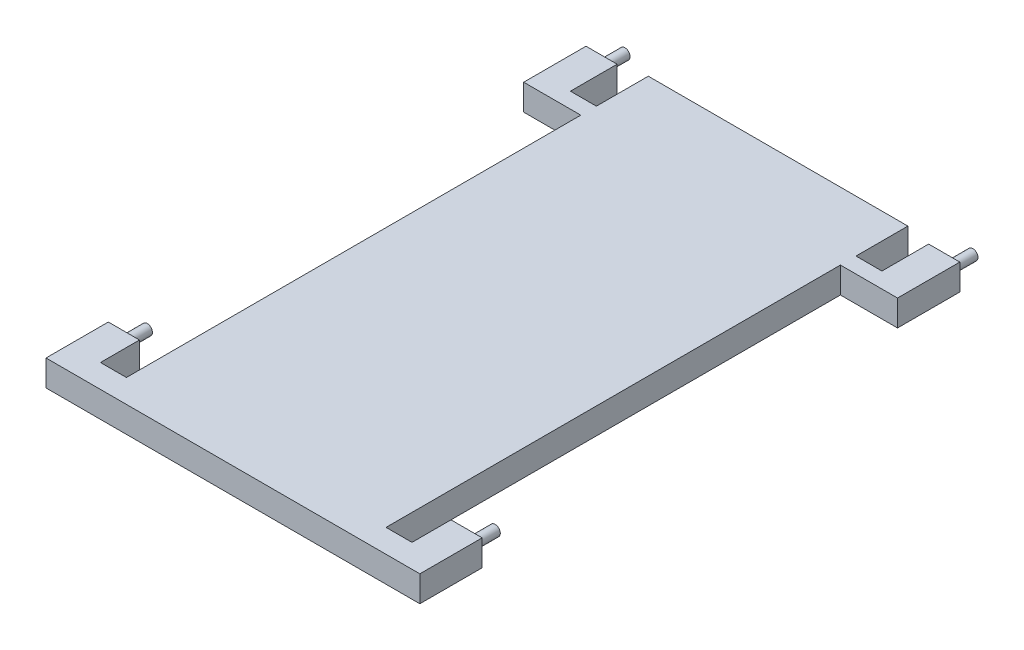
ISO-10303-21;
HEADER;
FILE_DESCRIPTION(('STEP AP214'),'2;1');
FILE_NAME('part.step','',(''),(''),'','','');
FILE_SCHEMA(('AUTOMOTIVE_DESIGN { 1 0 10303 214 1 1 1 1 }'));
ENDSEC;
DATA;
#1=APPLICATION_CONTEXT('core data for automotive mechanical design processes');
#2=APPLICATION_PROTOCOL_DEFINITION('international standard','automotive_design',2000,#1);
#3=PRODUCT_CONTEXT('',#1,'mechanical');
#4=PRODUCT('Part','Part','',(#3));
#5=PRODUCT_RELATED_PRODUCT_CATEGORY('part','',(#4));
#6=PRODUCT_DEFINITION_FORMATION('','',#4);
#7=PRODUCT_DEFINITION_CONTEXT('part definition',#1,'design');
#8=PRODUCT_DEFINITION('design','',#6,#7);
#9=PRODUCT_DEFINITION_SHAPE('','',#8);
#10=(LENGTH_UNIT() NAMED_UNIT(*) SI_UNIT(.MILLI.,.METRE.));
#11=(NAMED_UNIT(*) PLANE_ANGLE_UNIT() SI_UNIT($,.RADIAN.));
#12=(NAMED_UNIT(*) SI_UNIT($,.STERADIAN.) SOLID_ANGLE_UNIT());
#13=UNCERTAINTY_MEASURE_WITH_UNIT(LENGTH_MEASURE(1.E-05),#10,'distance_accuracy_value','');
#14=(GEOMETRIC_REPRESENTATION_CONTEXT(3) GLOBAL_UNCERTAINTY_ASSIGNED_CONTEXT((#13)) GLOBAL_UNIT_ASSIGNED_CONTEXT((#10,
#11,#12)) REPRESENTATION_CONTEXT('',''));
#15=CARTESIAN_POINT('',(0.,0.,0.));
#16=DIRECTION('',(0.,0.,1.));
#17=DIRECTION('',(1.,0.,0.));
#18=AXIS2_PLACEMENT_3D('',#15,#16,#17);
#19=CARTESIAN_POINT('',(1523.8355420944,50.,412.398825065192));
#20=DIRECTION('',(0.,0.,-1.));
#21=DIRECTION('',(-1.,0.,0.));
#22=AXIS2_PLACEMENT_3D('',#19,#20,#21);
#23=PLANE('',#22);
#24=DIRECTION('',(1.,0.,0.));
#25=VECTOR('',#24,1.);
#26=CARTESIAN_POINT('',(1523.8355420944,0.,412.398825065192));
#27=LINE('',#26,#25);
#28=CARTESIAN_POINT('',(803.835542094402,0.,412.398825065192));
#29=VERTEX_POINT('',#28);
#30=CARTESIAN_POINT('',(1523.8355420944,0.,412.398825065192));
#31=VERTEX_POINT('',#30);
#32=EDGE_CURVE('E135',#29,#31,#27,.T.);
#33=ORIENTED_EDGE('',*,*,#32,.T.);
#34=DIRECTION('',(0.,-1.,0.));
#35=VECTOR('',#34,1.);
#36=CARTESIAN_POINT('',(1523.8355420944,50.,412.398825065192));
#37=LINE('',#36,#35);
#38=CARTESIAN_POINT('',(1523.8355420944,50.,412.398825065192));
#39=VERTEX_POINT('',#38);
#40=EDGE_CURVE('E334',#39,#31,#37,.T.);
#41=ORIENTED_EDGE('',*,*,#40,.F.);
#42=DIRECTION('',(1.,0.,0.));
#43=VECTOR('',#42,1.);
#44=CARTESIAN_POINT('',(803.835542094402,50.,412.398825065192));
#45=LINE('',#44,#43);
#46=CARTESIAN_POINT('',(803.835542094402,50.,412.398825065192));
#47=VERTEX_POINT('',#46);
#48=EDGE_CURVE('E141',#47,#39,#45,.T.);
#49=ORIENTED_EDGE('',*,*,#48,.F.);
#50=DIRECTION('',(0.,-1.,0.));
#51=VECTOR('',#50,1.);
#52=CARTESIAN_POINT('',(803.835542094402,50.,412.398825065192));
#53=LINE('',#52,#51);
#54=EDGE_CURVE('E223',#47,#29,#53,.T.);
#55=ORIENTED_EDGE('',*,*,#54,.T.);
#56=EDGE_LOOP('',(#33,#41,#49,#55));
#57=FACE_BOUND('',#56,.T.);
#58=ADVANCED_FACE('F35',(#57),#23,.F.);
#59=CARTESIAN_POINT('',(1523.8355420944,50.,292.398825065192));
#60=DIRECTION('',(-1.,0.,0.));
#61=DIRECTION('',(0.,0.,1.));
#62=AXIS2_PLACEMENT_3D('',#59,#60,#61);
#63=PLANE('',#62);
#64=DIRECTION('',(0.,0.,-1.));
#65=VECTOR('',#64,1.);
#66=CARTESIAN_POINT('',(1523.8355420944,0.,292.398825065192));
#67=LINE('',#66,#65);
#68=CARTESIAN_POINT('',(1523.8355420944,0.,292.398825065192));
#69=VERTEX_POINT('',#68);
#70=EDGE_CURVE('E228',#31,#69,#67,.T.);
#71=ORIENTED_EDGE('',*,*,#70,.T.);
#72=DIRECTION('',(0.,-1.,0.));
#73=VECTOR('',#72,1.);
#74=CARTESIAN_POINT('',(1523.8355420944,50.,292.398825065192));
#75=LINE('',#74,#73);
#76=CARTESIAN_POINT('',(1523.8355420944,50.,292.398825065192));
#77=VERTEX_POINT('',#76);
#78=EDGE_CURVE('E331',#77,#69,#75,.T.);
#79=ORIENTED_EDGE('',*,*,#78,.F.);
#80=DIRECTION('',(0.,0.,-1.));
#81=VECTOR('',#80,1.);
#82=CARTESIAN_POINT('',(1523.8355420944,50.,292.398825065192));
#83=LINE('',#82,#81);
#84=EDGE_CURVE('E411',#39,#77,#83,.T.);
#85=ORIENTED_EDGE('',*,*,#84,.F.);
#86=ORIENTED_EDGE('',*,*,#40,.T.);
#87=EDGE_LOOP('',(#71,#79,#85,#86));
#88=FACE_BOUND('',#87,.T.);
#89=ADVANCED_FACE('F459',(#88),#63,.F.);
#90=CARTESIAN_POINT('',(1463.8355420944,50.,292.398825065192));
#91=DIRECTION('',(0.,0.,1.));
#92=DIRECTION('',(1.,0.,0.));
#93=AXIS2_PLACEMENT_3D('',#90,#91,#92);
#94=PLANE('',#93);
#95=CARTESIAN_POINT('',(1498.8355420944,25.,292.398825065192));
#96=DIRECTION('',(0.,0.,1.));
#97=DIRECTION('',(1.,0.,0.));
#98=AXIS2_PLACEMENT_3D('',#95,#96,#97);
#99=CIRCLE('',#98,10.0000000000001);
#100=CARTESIAN_POINT('',(1508.8355420944,25.,292.398825065192));
#101=VERTEX_POINT('',#100);
#102=EDGE_CURVE('E11',#101,#101,#99,.F.);
#103=ORIENTED_EDGE('',*,*,#102,.F.);
#104=EDGE_LOOP('',(#103));
#105=FACE_BOUND('',#104,.T.);
#106=DIRECTION('',(-1.,0.,0.));
#107=VECTOR('',#106,1.);
#108=CARTESIAN_POINT('',(1463.8355420944,0.,292.398825065192));
#109=LINE('',#108,#107);
#110=CARTESIAN_POINT('',(1463.8355420944,0.,292.398825065192));
#111=VERTEX_POINT('',#110);
#112=EDGE_CURVE('E231',#69,#111,#109,.T.);
#113=ORIENTED_EDGE('',*,*,#112,.T.);
#114=DIRECTION('',(0.,-1.,0.));
#115=VECTOR('',#114,1.);
#116=CARTESIAN_POINT('',(1463.8355420944,50.,292.398825065192));
#117=LINE('',#116,#115);
#118=CARTESIAN_POINT('',(1463.8355420944,50.,292.398825065192));
#119=VERTEX_POINT('',#118);
#120=EDGE_CURVE('E328',#119,#111,#117,.T.);
#121=ORIENTED_EDGE('',*,*,#120,.F.);
#122=DIRECTION('',(-1.,0.,0.));
#123=VECTOR('',#122,1.);
#124=CARTESIAN_POINT('',(1463.8355420944,50.,292.398825065192));
#125=LINE('',#124,#123);
#126=EDGE_CURVE('E413',#77,#119,#125,.T.);
#127=ORIENTED_EDGE('',*,*,#126,.F.);
#128=ORIENTED_EDGE('',*,*,#78,.T.);
#129=EDGE_LOOP('',(#113,#121,#127,#128));
#130=FACE_BOUND('',#129,.T.);
#131=ADVANCED_FACE('F456',(#105,#130),#94,.F.);
#132=CARTESIAN_POINT('',(1463.8355420944,50.,367.50947658537));
#133=DIRECTION('',(1.,0.,0.));
#134=DIRECTION('',(0.,0.,-1.));
#135=AXIS2_PLACEMENT_3D('',#132,#133,#134);
#136=PLANE('',#135);
#137=DIRECTION('',(0.,0.,1.));
#138=VECTOR('',#137,1.);
#139=CARTESIAN_POINT('',(1463.8355420944,0.,367.50947658537));
#140=LINE('',#139,#138);
#141=CARTESIAN_POINT('',(1463.8355420944,0.,367.50947658537));
#142=VERTEX_POINT('',#141);
#143=EDGE_CURVE('E233',#111,#142,#140,.T.);
#144=ORIENTED_EDGE('',*,*,#143,.T.);
#145=DIRECTION('',(0.,-1.,0.));
#146=VECTOR('',#145,1.);
#147=CARTESIAN_POINT('',(1463.8355420944,50.,367.50947658537));
#148=LINE('',#147,#146);
#149=CARTESIAN_POINT('',(1463.8355420944,50.,367.50947658537));
#150=VERTEX_POINT('',#149);
#151=EDGE_CURVE('E325',#150,#142,#148,.T.);
#152=ORIENTED_EDGE('',*,*,#151,.F.);
#153=DIRECTION('',(0.,0.,1.));
#154=VECTOR('',#153,1.);
#155=CARTESIAN_POINT('',(1463.8355420944,50.,367.50947658537));
#156=LINE('',#155,#154);
#157=EDGE_CURVE('E419',#119,#150,#156,.T.);
#158=ORIENTED_EDGE('',*,*,#157,.F.);
#159=ORIENTED_EDGE('',*,*,#120,.T.);
#160=EDGE_LOOP('',(#144,#152,#158,#159));
#161=FACE_BOUND('',#160,.T.);
#162=ADVANCED_FACE('F451',(#161),#136,.F.);
#163=CARTESIAN_POINT('',(1413.8355420944,50.,367.50947658537));
#164=DIRECTION('',(0.,0.,1.));
#165=DIRECTION('',(1.,0.,0.));
#166=AXIS2_PLACEMENT_3D('',#163,#164,#165);
#167=PLANE('',#166);
#168=DIRECTION('',(-1.,0.,0.));
#169=VECTOR('',#168,1.);
#170=CARTESIAN_POINT('',(1413.8355420944,0.,367.50947658537));
#171=LINE('',#170,#169);
#172=CARTESIAN_POINT('',(1413.8355420944,0.,367.50947658537));
#173=VERTEX_POINT('',#172);
#174=EDGE_CURVE('E235',#142,#173,#171,.T.);
#175=ORIENTED_EDGE('',*,*,#174,.T.);
#176=DIRECTION('',(0.,-1.,0.));
#177=VECTOR('',#176,1.);
#178=CARTESIAN_POINT('',(1413.8355420944,50.,367.50947658537));
#179=LINE('',#178,#177);
#180=CARTESIAN_POINT('',(1413.8355420944,50.,367.50947658537));
#181=VERTEX_POINT('',#180);
#182=EDGE_CURVE('E322',#181,#173,#179,.T.);
#183=ORIENTED_EDGE('',*,*,#182,.F.);
#184=DIRECTION('',(-1.,0.,0.));
#185=VECTOR('',#184,1.);
#186=CARTESIAN_POINT('',(1413.8355420944,50.,367.50947658537));
#187=LINE('',#186,#185);
#188=EDGE_CURVE('E421',#150,#181,#187,.T.);
#189=ORIENTED_EDGE('',*,*,#188,.F.);
#190=ORIENTED_EDGE('',*,*,#151,.T.);
#191=EDGE_LOOP('',(#175,#183,#189,#190));
#192=FACE_BOUND('',#191,.T.);
#193=ADVANCED_FACE('F446',(#192),#167,.F.);
#194=CARTESIAN_POINT('',(1413.8355420944,50.,-507.601174934808));
#195=DIRECTION('',(-1.,0.,0.));
#196=DIRECTION('',(0.,0.,1.));
#197=AXIS2_PLACEMENT_3D('',#194,#195,#196);
#198=PLANE('',#197);
#199=DIRECTION('',(0.,0.,-1.));
#200=VECTOR('',#199,1.);
#201=CARTESIAN_POINT('',(1413.8355420944,0.,-507.601174934808));
#202=LINE('',#201,#200);
#203=CARTESIAN_POINT('',(1413.8355420944,0.,-507.601174934808));
#204=VERTEX_POINT('',#203);
#205=EDGE_CURVE('E237',#173,#204,#202,.T.);
#206=ORIENTED_EDGE('',*,*,#205,.T.);
#207=DIRECTION('',(0.,-1.,0.));
#208=VECTOR('',#207,1.);
#209=CARTESIAN_POINT('',(1413.8355420944,50.,-507.601174934808));
#210=LINE('',#209,#208);
#211=CARTESIAN_POINT('',(1413.8355420944,50.,-507.601174934808));
#212=VERTEX_POINT('',#211);
#213=EDGE_CURVE('E319',#212,#204,#210,.T.);
#214=ORIENTED_EDGE('',*,*,#213,.F.);
#215=DIRECTION('',(0.,0.,-1.));
#216=VECTOR('',#215,1.);
#217=CARTESIAN_POINT('',(1413.8355420944,50.,-507.601174934808));
#218=LINE('',#217,#216);
#219=EDGE_CURVE('E423',#181,#212,#218,.T.);
#220=ORIENTED_EDGE('',*,*,#219,.F.);
#221=ORIENTED_EDGE('',*,*,#182,.T.);
#222=EDGE_LOOP('',(#206,#214,#220,#221));
#223=FACE_BOUND('',#222,.T.);
#224=ADVANCED_FACE('F442',(#223),#198,.F.);
#225=CARTESIAN_POINT('',(1523.8355420944,50.,-507.601174934808));
#226=DIRECTION('',(0.,0.,-1.));
#227=DIRECTION('',(-1.,0.,0.));
#228=AXIS2_PLACEMENT_3D('',#225,#226,#227);
#229=PLANE('',#228);
#230=DIRECTION('',(1.,0.,0.));
#231=VECTOR('',#230,1.);
#232=CARTESIAN_POINT('',(1523.8355420944,0.,-507.601174934808));
#233=LINE('',#232,#231);
#234=CARTESIAN_POINT('',(1523.8355420944,0.,-507.601174934808));
#235=VERTEX_POINT('',#234);
#236=EDGE_CURVE('E239',#204,#235,#233,.T.);
#237=ORIENTED_EDGE('',*,*,#236,.T.);
#238=DIRECTION('',(0.,-1.,0.));
#239=VECTOR('',#238,1.);
#240=CARTESIAN_POINT('',(1523.8355420944,50.,-507.601174934808));
#241=LINE('',#240,#239);
#242=CARTESIAN_POINT('',(1523.8355420944,50.,-507.601174934808));
#243=VERTEX_POINT('',#242);
#244=EDGE_CURVE('E316',#243,#235,#241,.T.);
#245=ORIENTED_EDGE('',*,*,#244,.F.);
#246=DIRECTION('',(1.,0.,0.));
#247=VECTOR('',#246,1.);
#248=CARTESIAN_POINT('',(1523.8355420944,50.,-507.601174934808));
#249=LINE('',#248,#247);
#250=EDGE_CURVE('E425',#212,#243,#249,.T.);
#251=ORIENTED_EDGE('',*,*,#250,.F.);
#252=ORIENTED_EDGE('',*,*,#213,.T.);
#253=EDGE_LOOP('',(#237,#245,#251,#252));
#254=FACE_BOUND('',#253,.T.);
#255=ADVANCED_FACE('F438',(#254),#229,.F.);
#256=CARTESIAN_POINT('',(1523.8355420944,50.,-627.601174934808));
#257=DIRECTION('',(-1.,0.,0.));
#258=DIRECTION('',(0.,0.,1.));
#259=AXIS2_PLACEMENT_3D('',#256,#257,#258);
#260=PLANE('',#259);
#261=DIRECTION('',(0.,0.,-1.));
#262=VECTOR('',#261,1.);
#263=CARTESIAN_POINT('',(1523.8355420944,0.,-627.601174934808));
#264=LINE('',#263,#262);
#265=CARTESIAN_POINT('',(1523.8355420944,0.,-627.601174934808));
#266=VERTEX_POINT('',#265);
#267=EDGE_CURVE('E241',#235,#266,#264,.T.);
#268=ORIENTED_EDGE('',*,*,#267,.T.);
#269=DIRECTION('',(0.,-1.,0.));
#270=VECTOR('',#269,1.);
#271=CARTESIAN_POINT('',(1523.8355420944,50.,-627.601174934808));
#272=LINE('',#271,#270);
#273=CARTESIAN_POINT('',(1523.8355420944,50.,-627.601174934808));
#274=VERTEX_POINT('',#273);
#275=EDGE_CURVE('E313',#274,#266,#272,.T.);
#276=ORIENTED_EDGE('',*,*,#275,.F.);
#277=DIRECTION('',(0.,0.,-1.));
#278=VECTOR('',#277,1.);
#279=CARTESIAN_POINT('',(1523.8355420944,50.,-627.601174934808));
#280=LINE('',#279,#278);
#281=EDGE_CURVE('E427',#243,#274,#280,.T.);
#282=ORIENTED_EDGE('',*,*,#281,.F.);
#283=ORIENTED_EDGE('',*,*,#244,.T.);
#284=EDGE_LOOP('',(#268,#276,#282,#283));
#285=FACE_BOUND('',#284,.T.);
#286=ADVANCED_FACE('F351',(#285),#260,.F.);
#287=CARTESIAN_POINT('',(1463.8355420944,50.,-627.601174934808));
#288=DIRECTION('',(0.,0.,1.));
#289=DIRECTION('',(1.,0.,0.));
#290=AXIS2_PLACEMENT_3D('',#287,#288,#289);
#291=PLANE('',#290);
#292=CARTESIAN_POINT('',(1498.8355420944,25.,-627.601174934808));
#293=DIRECTION('',(0.,0.,1.));
#294=DIRECTION('',(1.,0.,0.));
#295=AXIS2_PLACEMENT_3D('',#292,#293,#294);
#296=CIRCLE('',#295,10.0000000000001);
#297=CARTESIAN_POINT('',(1508.8355420944,25.,-627.601174934808));
#298=VERTEX_POINT('',#297);
#299=EDGE_CURVE('E43',#298,#298,#296,.F.);
#300=ORIENTED_EDGE('',*,*,#299,.F.);
#301=EDGE_LOOP('',(#300));
#302=FACE_BOUND('',#301,.T.);
#303=DIRECTION('',(-1.,0.,0.));
#304=VECTOR('',#303,1.);
#305=CARTESIAN_POINT('',(1463.8355420944,0.,-627.601174934808));
#306=LINE('',#305,#304);
#307=CARTESIAN_POINT('',(1463.8355420944,0.,-627.601174934808));
#308=VERTEX_POINT('',#307);
#309=EDGE_CURVE('E243',#266,#308,#306,.T.);
#310=ORIENTED_EDGE('',*,*,#309,.T.);
#311=DIRECTION('',(0.,-1.,0.));
#312=VECTOR('',#311,1.);
#313=CARTESIAN_POINT('',(1463.8355420944,50.,-627.601174934808));
#314=LINE('',#313,#312);
#315=CARTESIAN_POINT('',(1463.8355420944,50.,-627.601174934808));
#316=VERTEX_POINT('',#315);
#317=EDGE_CURVE('E310',#316,#308,#314,.T.);
#318=ORIENTED_EDGE('',*,*,#317,.F.);
#319=DIRECTION('',(-1.,0.,0.));
#320=VECTOR('',#319,1.);
#321=CARTESIAN_POINT('',(1463.8355420944,50.,-627.601174934808));
#322=LINE('',#321,#320);
#323=EDGE_CURVE('E429',#274,#316,#322,.T.);
#324=ORIENTED_EDGE('',*,*,#323,.F.);
#325=ORIENTED_EDGE('',*,*,#275,.T.);
#326=EDGE_LOOP('',(#310,#318,#324,#325));
#327=FACE_BOUND('',#326,.T.);
#328=ADVANCED_FACE('F347',(#302,#327),#291,.F.);
#329=CARTESIAN_POINT('',(1463.8355420944,50.,-537.601174934808));
#330=DIRECTION('',(1.,0.,0.));
#331=DIRECTION('',(0.,0.,-1.));
#332=AXIS2_PLACEMENT_3D('',#329,#330,#331);
#333=PLANE('',#332);
#334=DIRECTION('',(0.,0.,1.));
#335=VECTOR('',#334,1.);
#336=CARTESIAN_POINT('',(1463.8355420944,0.,-537.601174934808));
#337=LINE('',#336,#335);
#338=CARTESIAN_POINT('',(1463.8355420944,0.,-537.601174934808));
#339=VERTEX_POINT('',#338);
#340=EDGE_CURVE('E245',#308,#339,#337,.T.);
#341=ORIENTED_EDGE('',*,*,#340,.T.);
#342=DIRECTION('',(0.,-1.,0.));
#343=VECTOR('',#342,1.);
#344=CARTESIAN_POINT('',(1463.8355420944,50.,-537.601174934808));
#345=LINE('',#344,#343);
#346=CARTESIAN_POINT('',(1463.8355420944,50.,-537.601174934808));
#347=VERTEX_POINT('',#346);
#348=EDGE_CURVE('E307',#347,#339,#345,.T.);
#349=ORIENTED_EDGE('',*,*,#348,.F.);
#350=DIRECTION('',(0.,0.,1.));
#351=VECTOR('',#350,1.);
#352=CARTESIAN_POINT('',(1463.8355420944,50.,-537.601174934808));
#353=LINE('',#352,#351);
#354=EDGE_CURVE('E362',#316,#347,#353,.T.);
#355=ORIENTED_EDGE('',*,*,#354,.F.);
#356=ORIENTED_EDGE('',*,*,#317,.T.);
#357=EDGE_LOOP('',(#341,#349,#355,#356));
#358=FACE_BOUND('',#357,.T.);
#359=ADVANCED_FACE('F350',(#358),#333,.F.);
#360=CARTESIAN_POINT('',(1413.8355420944,50.,-537.601174934808));
#361=DIRECTION('',(0.,0.,1.));
#362=DIRECTION('',(1.,0.,0.));
#363=AXIS2_PLACEMENT_3D('',#360,#361,#362);
#364=PLANE('',#363);
#365=DIRECTION('',(-1.,0.,0.));
#366=VECTOR('',#365,1.);
#367=CARTESIAN_POINT('',(1413.8355420944,0.,-537.601174934808));
#368=LINE('',#367,#366);
#369=CARTESIAN_POINT('',(1413.8355420944,0.,-537.601174934808));
#370=VERTEX_POINT('',#369);
#371=EDGE_CURVE('E247',#339,#370,#368,.T.);
#372=ORIENTED_EDGE('',*,*,#371,.T.);
#373=DIRECTION('',(0.,-1.,0.));
#374=VECTOR('',#373,1.);
#375=CARTESIAN_POINT('',(1413.8355420944,50.,-537.601174934808));
#376=LINE('',#375,#374);
#377=CARTESIAN_POINT('',(1413.8355420944,50.,-537.601174934808));
#378=VERTEX_POINT('',#377);
#379=EDGE_CURVE('E304',#378,#370,#376,.T.);
#380=ORIENTED_EDGE('',*,*,#379,.F.);
#381=DIRECTION('',(-1.,0.,0.));
#382=VECTOR('',#381,1.);
#383=CARTESIAN_POINT('',(1413.8355420944,50.,-537.601174934808));
#384=LINE('',#383,#382);
#385=EDGE_CURVE('E378',#347,#378,#384,.T.);
#386=ORIENTED_EDGE('',*,*,#385,.F.);
#387=ORIENTED_EDGE('',*,*,#348,.T.);
#388=EDGE_LOOP('',(#372,#380,#386,#387));
#389=FACE_BOUND('',#388,.T.);
#390=ADVANCED_FACE('F369',(#389),#364,.F.);
#391=CARTESIAN_POINT('',(1413.8355420944,50.,-637.601174934808));
#392=DIRECTION('',(-1.,0.,0.));
#393=DIRECTION('',(0.,0.,1.));
#394=AXIS2_PLACEMENT_3D('',#391,#392,#393);
#395=PLANE('',#394);
#396=DIRECTION('',(0.,0.,-1.));
#397=VECTOR('',#396,1.);
#398=CARTESIAN_POINT('',(1413.8355420944,0.,-637.601174934808));
#399=LINE('',#398,#397);
#400=CARTESIAN_POINT('',(1413.8355420944,0.,-637.601174934808));
#401=VERTEX_POINT('',#400);
#402=EDGE_CURVE('E249',#370,#401,#399,.T.);
#403=ORIENTED_EDGE('',*,*,#402,.T.);
#404=DIRECTION('',(0.,-1.,0.));
#405=VECTOR('',#404,1.);
#406=CARTESIAN_POINT('',(1413.8355420944,50.,-637.601174934808));
#407=LINE('',#406,#405);
#408=CARTESIAN_POINT('',(1413.8355420944,50.,-637.601174934808));
#409=VERTEX_POINT('',#408);
#410=EDGE_CURVE('E301',#409,#401,#407,.T.);
#411=ORIENTED_EDGE('',*,*,#410,.F.);
#412=DIRECTION('',(0.,0.,-1.));
#413=VECTOR('',#412,1.);
#414=CARTESIAN_POINT('',(1413.8355420944,50.,-637.601174934808));
#415=LINE('',#414,#413);
#416=EDGE_CURVE('E375',#378,#409,#415,.T.);
#417=ORIENTED_EDGE('',*,*,#416,.F.);
#418=ORIENTED_EDGE('',*,*,#379,.T.);
#419=EDGE_LOOP('',(#403,#411,#417,#418));
#420=FACE_BOUND('',#419,.T.);
#421=ADVANCED_FACE('F373',(#420),#395,.F.);
#422=CARTESIAN_POINT('',(1413.8355420944,50.,-637.601174934808));
#423=DIRECTION('',(0.,0.,1.));
#424=DIRECTION('',(1.,0.,0.));
#425=AXIS2_PLACEMENT_3D('',#422,#423,#424);
#426=PLANE('',#425);
#427=DIRECTION('',(-1.,0.,0.));
#428=VECTOR('',#427,1.);
#429=CARTESIAN_POINT('',(1413.8355420944,0.,-637.601174934808));
#430=LINE('',#429,#428);
#431=CARTESIAN_POINT('',(913.835542094402,0.,-637.601174934808));
#432=VERTEX_POINT('',#431);
#433=EDGE_CURVE('E251',#401,#432,#430,.T.);
#434=ORIENTED_EDGE('',*,*,#433,.T.);
#435=DIRECTION('',(0.,-1.,0.));
#436=VECTOR('',#435,1.);
#437=CARTESIAN_POINT('',(913.835542094402,50.,-637.601174934808));
#438=LINE('',#437,#436);
#439=CARTESIAN_POINT('',(913.835542094402,50.,-637.601174934808));
#440=VERTEX_POINT('',#439);
#441=EDGE_CURVE('E298',#440,#432,#438,.T.);
#442=ORIENTED_EDGE('',*,*,#441,.F.);
#443=DIRECTION('',(-1.,0.,0.));
#444=VECTOR('',#443,1.);
#445=CARTESIAN_POINT('',(1413.8355420944,50.,-637.601174934808));
#446=LINE('',#445,#444);
#447=EDGE_CURVE('E377',#409,#440,#446,.T.);
#448=ORIENTED_EDGE('',*,*,#447,.F.);
#449=ORIENTED_EDGE('',*,*,#410,.T.);
#450=EDGE_LOOP('',(#434,#442,#448,#449));
#451=FACE_BOUND('',#450,.T.);
#452=ADVANCED_FACE('F484',(#451),#426,.F.);
#453=CARTESIAN_POINT('',(913.835542094402,50.,-637.601174934808));
#454=DIRECTION('',(1.,0.,0.));
#455=DIRECTION('',(0.,0.,-1.));
#456=AXIS2_PLACEMENT_3D('',#453,#454,#455);
#457=PLANE('',#456);
#458=DIRECTION('',(0.,0.,1.));
#459=VECTOR('',#458,1.);
#460=CARTESIAN_POINT('',(913.835542094402,0.,-637.601174934808));
#461=LINE('',#460,#459);
#462=CARTESIAN_POINT('',(913.835542094402,0.,-537.601174934808));
#463=VERTEX_POINT('',#462);
#464=EDGE_CURVE('E253',#432,#463,#461,.T.);
#465=ORIENTED_EDGE('',*,*,#464,.T.);
#466=DIRECTION('',(0.,-1.,0.));
#467=VECTOR('',#466,1.);
#468=CARTESIAN_POINT('',(913.835542094402,50.,-537.601174934808));
#469=LINE('',#468,#467);
#470=CARTESIAN_POINT('',(913.835542094402,50.,-537.601174934808));
#471=VERTEX_POINT('',#470);
#472=EDGE_CURVE('E295',#471,#463,#469,.T.);
#473=ORIENTED_EDGE('',*,*,#472,.F.);
#474=DIRECTION('',(0.,0.,1.));
#475=VECTOR('',#474,1.);
#476=CARTESIAN_POINT('',(913.835542094402,50.,-637.601174934808));
#477=LINE('',#476,#475);
#478=EDGE_CURVE('E380',#440,#471,#477,.T.);
#479=ORIENTED_EDGE('',*,*,#478,.F.);
#480=ORIENTED_EDGE('',*,*,#441,.T.);
#481=EDGE_LOOP('',(#465,#473,#479,#480));
#482=FACE_BOUND('',#481,.T.);
#483=ADVANCED_FACE('F487',(#482),#457,.F.);
#484=CARTESIAN_POINT('',(913.835542094402,50.,-537.601174934808));
#485=DIRECTION('',(0.,0.,1.));
#486=DIRECTION('',(1.,0.,0.));
#487=AXIS2_PLACEMENT_3D('',#484,#485,#486);
#488=PLANE('',#487);
#489=DIRECTION('',(-1.,0.,0.));
#490=VECTOR('',#489,1.);
#491=CARTESIAN_POINT('',(913.835542094402,0.,-537.601174934808));
#492=LINE('',#491,#490);
#493=CARTESIAN_POINT('',(863.835542094402,0.,-537.601174934808));
#494=VERTEX_POINT('',#493);
#495=EDGE_CURVE('E255',#463,#494,#492,.T.);
#496=ORIENTED_EDGE('',*,*,#495,.T.);
#497=DIRECTION('',(0.,-1.,0.));
#498=VECTOR('',#497,1.);
#499=CARTESIAN_POINT('',(863.835542094402,50.,-537.601174934808));
#500=LINE('',#499,#498);
#501=CARTESIAN_POINT('',(863.835542094402,50.,-537.601174934808));
#502=VERTEX_POINT('',#501);
#503=EDGE_CURVE('E292',#502,#494,#500,.T.);
#504=ORIENTED_EDGE('',*,*,#503,.F.);
#505=DIRECTION('',(-1.,0.,0.));
#506=VECTOR('',#505,1.);
#507=CARTESIAN_POINT('',(913.835542094402,50.,-537.601174934808));
#508=LINE('',#507,#506);
#509=EDGE_CURVE('E386',#471,#502,#508,.T.);
#510=ORIENTED_EDGE('',*,*,#509,.F.);
#511=ORIENTED_EDGE('',*,*,#472,.T.);
#512=EDGE_LOOP('',(#496,#504,#510,#511));
#513=FACE_BOUND('',#512,.T.);
#514=ADVANCED_FACE('F491',(#513),#488,.F.);
#515=CARTESIAN_POINT('',(863.835542094402,50.,-537.601174934808));
#516=DIRECTION('',(-1.,0.,0.));
#517=DIRECTION('',(0.,0.,1.));
#518=AXIS2_PLACEMENT_3D('',#515,#516,#517);
#519=PLANE('',#518);
#520=DIRECTION('',(0.,0.,-1.));
#521=VECTOR('',#520,1.);
#522=CARTESIAN_POINT('',(863.835542094402,0.,-537.601174934808));
#523=LINE('',#522,#521);
#524=CARTESIAN_POINT('',(863.835542094402,0.,-627.601174934808));
#525=VERTEX_POINT('',#524);
#526=EDGE_CURVE('E257',#494,#525,#523,.T.);
#527=ORIENTED_EDGE('',*,*,#526,.T.);
#528=DIRECTION('',(0.,-1.,0.));
#529=VECTOR('',#528,1.);
#530=CARTESIAN_POINT('',(863.835542094402,50.,-627.601174934808));
#531=LINE('',#530,#529);
#532=CARTESIAN_POINT('',(863.835542094402,50.,-627.601174934808));
#533=VERTEX_POINT('',#532);
#534=EDGE_CURVE('E289',#533,#525,#531,.T.);
#535=ORIENTED_EDGE('',*,*,#534,.F.);
#536=DIRECTION('',(0.,0.,-1.));
#537=VECTOR('',#536,1.);
#538=CARTESIAN_POINT('',(863.835542094402,50.,-537.601174934808));
#539=LINE('',#538,#537);
#540=EDGE_CURVE('E388',#502,#533,#539,.T.);
#541=ORIENTED_EDGE('',*,*,#540,.F.);
#542=ORIENTED_EDGE('',*,*,#503,.T.);
#543=EDGE_LOOP('',(#527,#535,#541,#542));
#544=FACE_BOUND('',#543,.T.);
#545=ADVANCED_FACE('F495',(#544),#519,.F.);
#546=CARTESIAN_POINT('',(863.835542094402,50.,-627.601174934808));
#547=DIRECTION('',(0.,0.,1.));
#548=DIRECTION('',(1.,0.,0.));
#549=AXIS2_PLACEMENT_3D('',#546,#547,#548);
#550=PLANE('',#549);
#551=CARTESIAN_POINT('',(828.835542094402,25.,-627.601174934808));
#552=DIRECTION('',(0.,0.,1.));
#553=DIRECTION('',(1.,0.,0.));
#554=AXIS2_PLACEMENT_3D('',#551,#552,#553);
#555=CIRCLE('',#554,9.99999999999998);
#556=CARTESIAN_POINT('',(838.835542094402,25.,-627.601174934808));
#557=VERTEX_POINT('',#556);
#558=EDGE_CURVE('E337',#557,#557,#555,.F.);
#559=ORIENTED_EDGE('',*,*,#558,.F.);
#560=EDGE_LOOP('',(#559));
#561=FACE_BOUND('',#560,.T.);
#562=DIRECTION('',(-1.,0.,0.));
#563=VECTOR('',#562,1.);
#564=CARTESIAN_POINT('',(863.835542094402,0.,-627.601174934808));
#565=LINE('',#564,#563);
#566=CARTESIAN_POINT('',(803.835542094402,0.,-627.601174934808));
#567=VERTEX_POINT('',#566);
#568=EDGE_CURVE('E259',#525,#567,#565,.T.);
#569=ORIENTED_EDGE('',*,*,#568,.T.);
#570=DIRECTION('',(0.,-1.,0.));
#571=VECTOR('',#570,1.);
#572=CARTESIAN_POINT('',(803.835542094402,50.,-627.601174934808));
#573=LINE('',#572,#571);
#574=CARTESIAN_POINT('',(803.835542094402,50.,-627.601174934808));
#575=VERTEX_POINT('',#574);
#576=EDGE_CURVE('E286',#575,#567,#573,.T.);
#577=ORIENTED_EDGE('',*,*,#576,.F.);
#578=DIRECTION('',(-1.,0.,0.));
#579=VECTOR('',#578,1.);
#580=CARTESIAN_POINT('',(863.835542094402,50.,-627.601174934808));
#581=LINE('',#580,#579);
#582=EDGE_CURVE('E390',#533,#575,#581,.T.);
#583=ORIENTED_EDGE('',*,*,#582,.F.);
#584=ORIENTED_EDGE('',*,*,#534,.T.);
#585=EDGE_LOOP('',(#569,#577,#583,#584));
#586=FACE_BOUND('',#585,.T.);
#587=ADVANCED_FACE('F499',(#561,#586),#550,.F.);
#588=CARTESIAN_POINT('',(803.835542094402,50.,-627.601174934808));
#589=DIRECTION('',(1.,0.,0.));
#590=DIRECTION('',(0.,0.,-1.));
#591=AXIS2_PLACEMENT_3D('',#588,#589,#590);
#592=PLANE('',#591);
#593=DIRECTION('',(0.,0.,1.));
#594=VECTOR('',#593,1.);
#595=CARTESIAN_POINT('',(803.835542094402,0.,-627.601174934808));
#596=LINE('',#595,#594);
#597=CARTESIAN_POINT('',(803.835542094402,0.,-507.601174934808));
#598=VERTEX_POINT('',#597);
#599=EDGE_CURVE('E261',#567,#598,#596,.T.);
#600=ORIENTED_EDGE('',*,*,#599,.T.);
#601=DIRECTION('',(0.,-1.,0.));
#602=VECTOR('',#601,1.);
#603=CARTESIAN_POINT('',(803.835542094402,50.,-507.601174934808));
#604=LINE('',#603,#602);
#605=CARTESIAN_POINT('',(803.835542094402,50.,-507.601174934808));
#606=VERTEX_POINT('',#605);
#607=EDGE_CURVE('E283',#606,#598,#604,.T.);
#608=ORIENTED_EDGE('',*,*,#607,.F.);
#609=DIRECTION('',(0.,0.,1.));
#610=VECTOR('',#609,1.);
#611=CARTESIAN_POINT('',(803.835542094402,50.,-627.601174934808));
#612=LINE('',#611,#610);
#613=EDGE_CURVE('E392',#575,#606,#612,.T.);
#614=ORIENTED_EDGE('',*,*,#613,.F.);
#615=ORIENTED_EDGE('',*,*,#576,.T.);
#616=EDGE_LOOP('',(#600,#608,#614,#615));
#617=FACE_BOUND('',#616,.T.);
#618=ADVANCED_FACE('F503',(#617),#592,.F.);
#619=CARTESIAN_POINT('',(803.835542094402,50.,-507.601174934808));
#620=DIRECTION('',(0.,0.,-1.));
#621=DIRECTION('',(-1.,0.,0.));
#622=AXIS2_PLACEMENT_3D('',#619,#620,#621);
#623=PLANE('',#622);
#624=DIRECTION('',(1.,0.,0.));
#625=VECTOR('',#624,1.);
#626=CARTESIAN_POINT('',(803.835542094402,0.,-507.601174934808));
#627=LINE('',#626,#625);
#628=CARTESIAN_POINT('',(913.835542094402,0.,-507.601174934808));
#629=VERTEX_POINT('',#628);
#630=EDGE_CURVE('E263',#598,#629,#627,.T.);
#631=ORIENTED_EDGE('',*,*,#630,.T.);
#632=DIRECTION('',(0.,-1.,0.));
#633=VECTOR('',#632,1.);
#634=CARTESIAN_POINT('',(913.835542094402,50.,-507.601174934808));
#635=LINE('',#634,#633);
#636=CARTESIAN_POINT('',(913.835542094402,50.,-507.601174934808));
#637=VERTEX_POINT('',#636);
#638=EDGE_CURVE('E280',#637,#629,#635,.T.);
#639=ORIENTED_EDGE('',*,*,#638,.F.);
#640=DIRECTION('',(1.,0.,0.));
#641=VECTOR('',#640,1.);
#642=CARTESIAN_POINT('',(803.835542094402,50.,-507.601174934808));
#643=LINE('',#642,#641);
#644=EDGE_CURVE('E394',#606,#637,#643,.T.);
#645=ORIENTED_EDGE('',*,*,#644,.F.);
#646=ORIENTED_EDGE('',*,*,#607,.T.);
#647=EDGE_LOOP('',(#631,#639,#645,#646));
#648=FACE_BOUND('',#647,.T.);
#649=ADVANCED_FACE('F507',(#648),#623,.F.);
#650=CARTESIAN_POINT('',(913.835542094402,50.,-507.601174934808));
#651=DIRECTION('',(1.,0.,0.));
#652=DIRECTION('',(0.,0.,-1.));
#653=AXIS2_PLACEMENT_3D('',#650,#651,#652);
#654=PLANE('',#653);
#655=DIRECTION('',(0.,0.,1.));
#656=VECTOR('',#655,1.);
#657=CARTESIAN_POINT('',(913.835542094402,0.,-507.601174934808));
#658=LINE('',#657,#656);
#659=CARTESIAN_POINT('',(913.835542094402,0.,367.50947658537));
#660=VERTEX_POINT('',#659);
#661=EDGE_CURVE('E265',#629,#660,#658,.T.);
#662=ORIENTED_EDGE('',*,*,#661,.T.);
#663=DIRECTION('',(0.,-1.,0.));
#664=VECTOR('',#663,1.);
#665=CARTESIAN_POINT('',(913.835542094402,50.,367.50947658537));
#666=LINE('',#665,#664);
#667=CARTESIAN_POINT('',(913.835542094402,50.,367.50947658537));
#668=VERTEX_POINT('',#667);
#669=EDGE_CURVE('E277',#668,#660,#666,.T.);
#670=ORIENTED_EDGE('',*,*,#669,.F.);
#671=DIRECTION('',(0.,0.,1.));
#672=VECTOR('',#671,1.);
#673=CARTESIAN_POINT('',(913.835542094402,50.,-507.601174934808));
#674=LINE('',#673,#672);
#675=EDGE_CURVE('E396',#637,#668,#674,.T.);
#676=ORIENTED_EDGE('',*,*,#675,.F.);
#677=ORIENTED_EDGE('',*,*,#638,.T.);
#678=EDGE_LOOP('',(#662,#670,#676,#677));
#679=FACE_BOUND('',#678,.T.);
#680=ADVANCED_FACE('F402',(#679),#654,.F.);
#681=CARTESIAN_POINT('',(913.835542094402,50.,367.50947658537));
#682=DIRECTION('',(0.,0.,1.));
#683=DIRECTION('',(1.,0.,0.));
#684=AXIS2_PLACEMENT_3D('',#681,#682,#683);
#685=PLANE('',#684);
#686=DIRECTION('',(-1.,0.,0.));
#687=VECTOR('',#686,1.);
#688=CARTESIAN_POINT('',(913.835542094402,0.,367.50947658537));
#689=LINE('',#688,#687);
#690=CARTESIAN_POINT('',(863.835542094402,0.,367.50947658537));
#691=VERTEX_POINT('',#690);
#692=EDGE_CURVE('E267',#660,#691,#689,.T.);
#693=ORIENTED_EDGE('',*,*,#692,.T.);
#694=DIRECTION('',(0.,-1.,0.));
#695=VECTOR('',#694,1.);
#696=CARTESIAN_POINT('',(863.835542094402,50.,367.50947658537));
#697=LINE('',#696,#695);
#698=CARTESIAN_POINT('',(863.835542094402,50.,367.50947658537));
#699=VERTEX_POINT('',#698);
#700=EDGE_CURVE('E218',#699,#691,#697,.T.);
#701=ORIENTED_EDGE('',*,*,#700,.F.);
#702=DIRECTION('',(-1.,0.,0.));
#703=VECTOR('',#702,1.);
#704=CARTESIAN_POINT('',(913.835542094402,50.,367.50947658537));
#705=LINE('',#704,#703);
#706=EDGE_CURVE('E209',#668,#699,#705,.T.);
#707=ORIENTED_EDGE('',*,*,#706,.F.);
#708=ORIENTED_EDGE('',*,*,#669,.T.);
#709=EDGE_LOOP('',(#693,#701,#707,#708));
#710=FACE_BOUND('',#709,.T.);
#711=ADVANCED_FACE('F406',(#710),#685,.F.);
#712=CARTESIAN_POINT('',(863.835542094402,50.,367.50947658537));
#713=DIRECTION('',(-1.,0.,0.));
#714=DIRECTION('',(0.,0.,1.));
#715=AXIS2_PLACEMENT_3D('',#712,#713,#714);
#716=PLANE('',#715);
#717=DIRECTION('',(0.,0.,-1.));
#718=VECTOR('',#717,1.);
#719=CARTESIAN_POINT('',(863.835542094402,0.,367.50947658537));
#720=LINE('',#719,#718);
#721=CARTESIAN_POINT('',(863.835542094402,0.,292.398825065192));
#722=VERTEX_POINT('',#721);
#723=EDGE_CURVE('E217',#691,#722,#720,.T.);
#724=ORIENTED_EDGE('',*,*,#723,.T.);
#725=DIRECTION('',(0.,-1.,0.));
#726=VECTOR('',#725,1.);
#727=CARTESIAN_POINT('',(863.835542094402,50.,292.398825065192));
#728=LINE('',#727,#726);
#729=CARTESIAN_POINT('',(863.835542094402,50.,292.398825065192));
#730=VERTEX_POINT('',#729);
#731=EDGE_CURVE('E214',#730,#722,#728,.T.);
#732=ORIENTED_EDGE('',*,*,#731,.F.);
#733=DIRECTION('',(0.,0.,-1.));
#734=VECTOR('',#733,1.);
#735=CARTESIAN_POINT('',(863.835542094402,50.,367.50947658537));
#736=LINE('',#735,#734);
#737=EDGE_CURVE('E203',#699,#730,#736,.T.);
#738=ORIENTED_EDGE('',*,*,#737,.F.);
#739=ORIENTED_EDGE('',*,*,#700,.T.);
#740=EDGE_LOOP('',(#724,#732,#738,#739));
#741=FACE_BOUND('',#740,.T.);
#742=ADVANCED_FACE('F215',(#741),#716,.F.);
#743=CARTESIAN_POINT('',(863.835542094402,50.,292.398825065192));
#744=DIRECTION('',(0.,0.,1.));
#745=DIRECTION('',(1.,0.,0.));
#746=AXIS2_PLACEMENT_3D('',#743,#744,#745);
#747=PLANE('',#746);
#748=CARTESIAN_POINT('',(828.835542094402,25.,292.398825065192));
#749=DIRECTION('',(0.,0.,1.));
#750=DIRECTION('',(1.,0.,0.));
#751=AXIS2_PLACEMENT_3D('',#748,#749,#750);
#752=CIRCLE('',#751,9.99999999999998);
#753=CARTESIAN_POINT('',(838.835542094402,25.,292.398825065192));
#754=VERTEX_POINT('',#753);
#755=EDGE_CURVE('E340',#754,#754,#752,.F.);
#756=ORIENTED_EDGE('',*,*,#755,.F.);
#757=EDGE_LOOP('',(#756));
#758=FACE_BOUND('',#757,.T.);
#759=DIRECTION('',(-1.,0.,0.));
#760=VECTOR('',#759,1.);
#761=CARTESIAN_POINT('',(863.835542094402,0.,292.398825065192));
#762=LINE('',#761,#760);
#763=CARTESIAN_POINT('',(803.835542094402,0.,292.398825065192));
#764=VERTEX_POINT('',#763);
#765=EDGE_CURVE('E128',#722,#764,#762,.T.);
#766=ORIENTED_EDGE('',*,*,#765,.T.);
#767=DIRECTION('',(0.,-1.,0.));
#768=VECTOR('',#767,1.);
#769=CARTESIAN_POINT('',(803.835542094402,50.,292.398825065192));
#770=LINE('',#769,#768);
#771=CARTESIAN_POINT('',(803.835542094402,50.,292.398825065192));
#772=VERTEX_POINT('',#771);
#773=EDGE_CURVE('E219',#772,#764,#770,.T.);
#774=ORIENTED_EDGE('',*,*,#773,.F.);
#775=DIRECTION('',(-1.,0.,0.));
#776=VECTOR('',#775,1.);
#777=CARTESIAN_POINT('',(863.835542094402,50.,292.398825065192));
#778=LINE('',#777,#776);
#779=EDGE_CURVE('E207',#730,#772,#778,.T.);
#780=ORIENTED_EDGE('',*,*,#779,.F.);
#781=ORIENTED_EDGE('',*,*,#731,.T.);
#782=EDGE_LOOP('',(#766,#774,#780,#781));
#783=FACE_BOUND('',#782,.T.);
#784=ADVANCED_FACE('F221',(#758,#783),#747,.F.);
#785=CARTESIAN_POINT('',(803.835542094402,50.,292.398825065192));
#786=DIRECTION('',(1.,0.,0.));
#787=DIRECTION('',(0.,0.,-1.));
#788=AXIS2_PLACEMENT_3D('',#785,#786,#787);
#789=PLANE('',#788);
#790=DIRECTION('',(0.,0.,1.));
#791=VECTOR('',#790,1.);
#792=CARTESIAN_POINT('',(803.835542094402,0.,292.398825065192));
#793=LINE('',#792,#791);
#794=EDGE_CURVE('E271',#764,#29,#793,.T.);
#795=ORIENTED_EDGE('',*,*,#794,.T.);
#796=ORIENTED_EDGE('',*,*,#54,.F.);
#797=DIRECTION('',(0.,0.,1.));
#798=VECTOR('',#797,1.);
#799=CARTESIAN_POINT('',(803.835542094402,50.,292.398825065192));
#800=LINE('',#799,#798);
#801=EDGE_CURVE('E51',#772,#47,#800,.T.);
#802=ORIENTED_EDGE('',*,*,#801,.F.);
#803=ORIENTED_EDGE('',*,*,#773,.T.);
#804=EDGE_LOOP('',(#795,#796,#802,#803));
#805=FACE_BOUND('',#804,.T.);
#806=ADVANCED_FACE('F408',(#805),#789,.F.);
#807=CARTESIAN_POINT('',(0.,50.,0.));
#808=DIRECTION('',(0.,-1.,0.));
#809=DIRECTION('',(0.,0.,-1.));
#810=AXIS2_PLACEMENT_3D('',#807,#808,#809);
#811=PLANE('',#810);
#812=ORIENTED_EDGE('',*,*,#48,.T.);
#813=ORIENTED_EDGE('',*,*,#84,.T.);
#814=ORIENTED_EDGE('',*,*,#126,.T.);
#815=ORIENTED_EDGE('',*,*,#157,.T.);
#816=ORIENTED_EDGE('',*,*,#188,.T.);
#817=ORIENTED_EDGE('',*,*,#219,.T.);
#818=ORIENTED_EDGE('',*,*,#250,.T.);
#819=ORIENTED_EDGE('',*,*,#281,.T.);
#820=ORIENTED_EDGE('',*,*,#323,.T.);
#821=ORIENTED_EDGE('',*,*,#354,.T.);
#822=ORIENTED_EDGE('',*,*,#385,.T.);
#823=ORIENTED_EDGE('',*,*,#416,.T.);
#824=ORIENTED_EDGE('',*,*,#447,.T.);
#825=ORIENTED_EDGE('',*,*,#478,.T.);
#826=ORIENTED_EDGE('',*,*,#509,.T.);
#827=ORIENTED_EDGE('',*,*,#540,.T.);
#828=ORIENTED_EDGE('',*,*,#582,.T.);
#829=ORIENTED_EDGE('',*,*,#613,.T.);
#830=ORIENTED_EDGE('',*,*,#644,.T.);
#831=ORIENTED_EDGE('',*,*,#675,.T.);
#832=ORIENTED_EDGE('',*,*,#706,.T.);
#833=ORIENTED_EDGE('',*,*,#737,.T.);
#834=ORIENTED_EDGE('',*,*,#779,.T.);
#835=ORIENTED_EDGE('',*,*,#801,.T.);
#836=EDGE_LOOP('',(#812,#813,#814,#815,#816,#817,#818,#819,#820,#821,#822,#823,#824,#825,#826,
#827,#828,#829,#830,#831,#832,#833,#834,#835));
#837=FACE_BOUND('',#836,.T.);
#838=ADVANCED_FACE('F205',(#837),#811,.F.);
#839=CARTESIAN_POINT('',(0.,0.,0.));
#840=DIRECTION('',(0.,-1.,0.));
#841=DIRECTION('',(0.,0.,-1.));
#842=AXIS2_PLACEMENT_3D('',#839,#840,#841);
#843=PLANE('',#842);
#844=ORIENTED_EDGE('',*,*,#32,.F.);
#845=ORIENTED_EDGE('',*,*,#794,.F.);
#846=ORIENTED_EDGE('',*,*,#765,.F.);
#847=ORIENTED_EDGE('',*,*,#723,.F.);
#848=ORIENTED_EDGE('',*,*,#692,.F.);
#849=ORIENTED_EDGE('',*,*,#661,.F.);
#850=ORIENTED_EDGE('',*,*,#630,.F.);
#851=ORIENTED_EDGE('',*,*,#599,.F.);
#852=ORIENTED_EDGE('',*,*,#568,.F.);
#853=ORIENTED_EDGE('',*,*,#526,.F.);
#854=ORIENTED_EDGE('',*,*,#495,.F.);
#855=ORIENTED_EDGE('',*,*,#464,.F.);
#856=ORIENTED_EDGE('',*,*,#433,.F.);
#857=ORIENTED_EDGE('',*,*,#402,.F.);
#858=ORIENTED_EDGE('',*,*,#371,.F.);
#859=ORIENTED_EDGE('',*,*,#340,.F.);
#860=ORIENTED_EDGE('',*,*,#309,.F.);
#861=ORIENTED_EDGE('',*,*,#267,.F.);
#862=ORIENTED_EDGE('',*,*,#236,.F.);
#863=ORIENTED_EDGE('',*,*,#205,.F.);
#864=ORIENTED_EDGE('',*,*,#174,.F.);
#865=ORIENTED_EDGE('',*,*,#143,.F.);
#866=ORIENTED_EDGE('',*,*,#112,.F.);
#867=ORIENTED_EDGE('',*,*,#70,.F.);
#868=EDGE_LOOP('',(#844,#845,#846,#847,#848,#849,#850,#851,#852,#853,#854,#855,#856,#857,#858,
#859,#860,#861,#862,#863,#864,#865,#866,#867));
#869=FACE_BOUND('',#868,.T.);
#870=ADVANCED_FACE('F364',(#869),#843,.T.);
#871=CARTESIAN_POINT('',(828.835542094402,25.,-677.601174934808));
#872=DIRECTION('',(0.,0.,1.));
#873=DIRECTION('',(1.,0.,0.));
#874=AXIS2_PLACEMENT_3D('',#871,#872,#873);
#875=CYLINDRICAL_SURFACE('',#874,9.99999999999998);
#876=CARTESIAN_POINT('',(828.835542094402,25.,-677.601174934808));
#877=DIRECTION('',(0.,0.,-1.));
#878=DIRECTION('',(-1.,0.,0.));
#879=AXIS2_PLACEMENT_3D('',#876,#877,#878);
#880=CIRCLE('',#879,9.99999999999998);
#881=CARTESIAN_POINT('',(818.835542094402,25.,-677.601174934808));
#882=VERTEX_POINT('',#881);
#883=EDGE_CURVE('E229',#882,#882,#880,.T.);
#884=ORIENTED_EDGE('',*,*,#883,.F.);
#885=EDGE_LOOP('',(#884));
#886=FACE_BOUND('',#885,.T.);
#887=ORIENTED_EDGE('',*,*,#558,.T.);
#888=EDGE_LOOP('',(#887));
#889=FACE_BOUND('',#888,.T.);
#890=ADVANCED_FACE('F525',(#886,#889),#875,.T.);
#891=CARTESIAN_POINT('',(828.835542094402,25.,-677.601174934808));
#892=DIRECTION('',(0.,0.,-1.));
#893=DIRECTION('',(-1.,0.,0.));
#894=AXIS2_PLACEMENT_3D('',#891,#892,#893);
#895=PLANE('',#894);
#896=ORIENTED_EDGE('',*,*,#883,.T.);
#897=EDGE_LOOP('',(#896));
#898=FACE_BOUND('',#897,.T.);
#899=ADVANCED_FACE('F530',(#898),#895,.T.);
#900=CARTESIAN_POINT('',(828.835542094402,25.,242.398825065192));
#901=DIRECTION('',(0.,0.,1.));
#902=DIRECTION('',(1.,0.,0.));
#903=AXIS2_PLACEMENT_3D('',#900,#901,#902);
#904=CYLINDRICAL_SURFACE('',#903,9.99999999999998);
#905=CARTESIAN_POINT('',(828.835542094402,25.,242.398825065192));
#906=DIRECTION('',(0.,0.,-1.));
#907=DIRECTION('',(-1.,0.,0.));
#908=AXIS2_PLACEMENT_3D('',#905,#906,#907);
#909=CIRCLE('',#908,9.99999999999998);
#910=CARTESIAN_POINT('',(818.835542094402,25.,242.398825065192));
#911=VERTEX_POINT('',#910);
#912=EDGE_CURVE('E565',#911,#911,#909,.T.);
#913=ORIENTED_EDGE('',*,*,#912,.F.);
#914=EDGE_LOOP('',(#913));
#915=FACE_BOUND('',#914,.T.);
#916=ORIENTED_EDGE('',*,*,#755,.T.);
#917=EDGE_LOOP('',(#916));
#918=FACE_BOUND('',#917,.T.);
#919=ADVANCED_FACE('F534',(#915,#918),#904,.T.);
#920=CARTESIAN_POINT('',(828.835542094402,25.,242.398825065192));
#921=DIRECTION('',(0.,0.,-1.));
#922=DIRECTION('',(-1.,0.,0.));
#923=AXIS2_PLACEMENT_3D('',#920,#921,#922);
#924=PLANE('',#923);
#925=ORIENTED_EDGE('',*,*,#912,.T.);
#926=EDGE_LOOP('',(#925));
#927=FACE_BOUND('',#926,.T.);
#928=ADVANCED_FACE('F538',(#927),#924,.T.);
#929=CARTESIAN_POINT('',(1498.8355420944,25.,-677.601174934808));
#930=DIRECTION('',(0.,0.,1.));
#931=DIRECTION('',(1.,0.,0.));
#932=AXIS2_PLACEMENT_3D('',#929,#930,#931);
#933=CYLINDRICAL_SURFACE('',#932,10.0000000000001);
#934=CARTESIAN_POINT('',(1498.8355420944,25.,-677.601174934808));
#935=DIRECTION('',(0.,0.,-1.));
#936=DIRECTION('',(-1.,0.,0.));
#937=AXIS2_PLACEMENT_3D('',#934,#935,#936);
#938=CIRCLE('',#937,10.0000000000001);
#939=CARTESIAN_POINT('',(1488.8355420944,25.,-677.601174934808));
#940=VERTEX_POINT('',#939);
#941=EDGE_CURVE('E562',#940,#940,#938,.T.);
#942=ORIENTED_EDGE('',*,*,#941,.F.);
#943=EDGE_LOOP('',(#942));
#944=FACE_BOUND('',#943,.T.);
#945=ORIENTED_EDGE('',*,*,#299,.T.);
#946=EDGE_LOOP('',(#945));
#947=FACE_BOUND('',#946,.T.);
#948=ADVANCED_FACE('F345',(#944,#947),#933,.T.);
#949=CARTESIAN_POINT('',(1498.8355420944,25.,-677.601174934808));
#950=DIRECTION('',(0.,0.,-1.));
#951=DIRECTION('',(-1.,0.,0.));
#952=AXIS2_PLACEMENT_3D('',#949,#950,#951);
#953=PLANE('',#952);
#954=ORIENTED_EDGE('',*,*,#941,.T.);
#955=EDGE_LOOP('',(#954));
#956=FACE_BOUND('',#955,.T.);
#957=ADVANCED_FACE('F545',(#956),#953,.T.);
#958=CARTESIAN_POINT('',(1498.8355420944,25.,242.398825065192));
#959=DIRECTION('',(0.,0.,1.));
#960=DIRECTION('',(1.,0.,0.));
#961=AXIS2_PLACEMENT_3D('',#958,#959,#960);
#962=CYLINDRICAL_SURFACE('',#961,10.0000000000001);
#963=CARTESIAN_POINT('',(1498.8355420944,25.,242.398825065192));
#964=DIRECTION('',(0.,0.,-1.));
#965=DIRECTION('',(-1.,0.,0.));
#966=AXIS2_PLACEMENT_3D('',#963,#964,#965);
#967=CIRCLE('',#966,10.0000000000001);
#968=CARTESIAN_POINT('',(1488.8355420944,25.,242.398825065192));
#969=VERTEX_POINT('',#968);
#970=EDGE_CURVE('E561',#969,#969,#967,.T.);
#971=ORIENTED_EDGE('',*,*,#970,.F.);
#972=EDGE_LOOP('',(#971));
#973=FACE_BOUND('',#972,.T.);
#974=ORIENTED_EDGE('',*,*,#102,.T.);
#975=EDGE_LOOP('',(#974));
#976=FACE_BOUND('',#975,.T.);
#977=ADVANCED_FACE('F549',(#973,#976),#962,.T.);
#978=CARTESIAN_POINT('',(1498.8355420944,25.,242.398825065192));
#979=DIRECTION('',(0.,0.,-1.));
#980=DIRECTION('',(-1.,0.,0.));
#981=AXIS2_PLACEMENT_3D('',#978,#979,#980);
#982=PLANE('',#981);
#983=ORIENTED_EDGE('',*,*,#970,.T.);
#984=EDGE_LOOP('',(#983));
#985=FACE_BOUND('',#984,.T.);
#986=ADVANCED_FACE('F553',(#985),#982,.T.);
#987=CLOSED_SHELL('',(#58,#89,#131,#162,#193,#224,#255,#286,#328,#359,#390,#421,#452,#483,#514,
#545,#587,#618,#649,#680,#711,#742,#784,#806,#838,#870,#890,#899,#919,#928,#948,#957,#977,#986));
#988=MANIFOLD_SOLID_BREP('B2',#987);
#989=ADVANCED_BREP_SHAPE_REPRESENTATION('',(#18,#988),#14);
#990=SHAPE_DEFINITION_REPRESENTATION(#9,#989);
ENDSEC;
END-ISO-10303-21;
